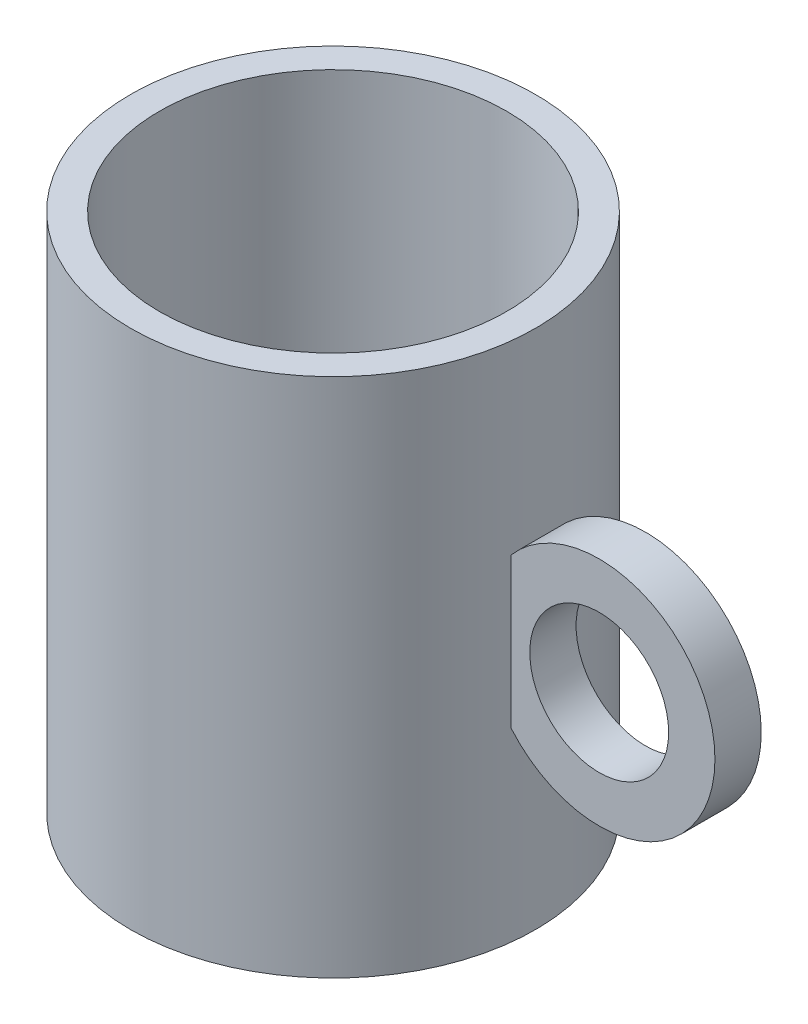
ISO-10303-21;
HEADER;
FILE_DESCRIPTION(('STEP AP214'),'2;1');
FILE_NAME('part.step','',(''),(''),'','','');
FILE_SCHEMA(('AUTOMOTIVE_DESIGN { 1 0 10303 214 1 1 1 1 }'));
ENDSEC;
DATA;
#1=APPLICATION_CONTEXT('core data for automotive mechanical design processes');
#2=APPLICATION_PROTOCOL_DEFINITION('international standard','automotive_design',2000,#1);
#3=PRODUCT_CONTEXT('',#1,'mechanical');
#4=PRODUCT('Part','Part','',(#3));
#5=PRODUCT_RELATED_PRODUCT_CATEGORY('part','',(#4));
#6=PRODUCT_DEFINITION_FORMATION('','',#4);
#7=PRODUCT_DEFINITION_CONTEXT('part definition',#1,'design');
#8=PRODUCT_DEFINITION('design','',#6,#7);
#9=PRODUCT_DEFINITION_SHAPE('','',#8);
#10=(LENGTH_UNIT() NAMED_UNIT(*) SI_UNIT(.MILLI.,.METRE.));
#11=(NAMED_UNIT(*) PLANE_ANGLE_UNIT() SI_UNIT($,.RADIAN.));
#12=(NAMED_UNIT(*) SI_UNIT($,.STERADIAN.) SOLID_ANGLE_UNIT());
#13=UNCERTAINTY_MEASURE_WITH_UNIT(LENGTH_MEASURE(1.E-05),#10,'distance_accuracy_value','');
#14=(GEOMETRIC_REPRESENTATION_CONTEXT(3) GLOBAL_UNCERTAINTY_ASSIGNED_CONTEXT((#13)) GLOBAL_UNIT_ASSIGNED_CONTEXT((#10,
#11,#12)) REPRESENTATION_CONTEXT('',''));
#15=CARTESIAN_POINT('',(0.,0.,0.));
#16=DIRECTION('',(0.,0.,1.));
#17=DIRECTION('',(1.,0.,0.));
#18=AXIS2_PLACEMENT_3D('',#15,#16,#17);
#19=CARTESIAN_POINT('',(0.,90.,0.));
#20=DIRECTION('',(0.,-1.,0.));
#21=DIRECTION('',(0.,0.,-1.));
#22=AXIS2_PLACEMENT_3D('',#19,#20,#21);
#23=CYLINDRICAL_SURFACE('',#22,35.);
#24=CARTESIAN_POINT('',(0.,0.,0.));
#25=DIRECTION('',(0.,1.,0.));
#26=DIRECTION('',(0.,0.,1.));
#27=AXIS2_PLACEMENT_3D('',#24,#25,#26);
#28=CIRCLE('',#27,35.);
#29=CARTESIAN_POINT('',(0.,0.,35.));
#30=VERTEX_POINT('',#29);
#31=EDGE_CURVE('E116',#30,#30,#28,.T.);
#32=ORIENTED_EDGE('',*,*,#31,.T.);
#33=EDGE_LOOP('',(#32));
#34=FACE_BOUND('',#33,.T.);
#35=CARTESIAN_POINT('',(0.,90.,0.));
#36=DIRECTION('',(0.,1.,0.));
#37=DIRECTION('',(0.,0.,1.));
#38=AXIS2_PLACEMENT_3D('',#35,#36,#37);
#39=CIRCLE('',#38,35.);
#40=CARTESIAN_POINT('',(0.,90.,35.));
#41=VERTEX_POINT('',#40);
#42=EDGE_CURVE('E97',#41,#41,#39,.T.);
#43=ORIENTED_EDGE('',*,*,#42,.F.);
#44=EDGE_LOOP('',(#43));
#45=FACE_BOUND('',#44,.T.);
#46=CARTESIAN_POINT('',(34.7706773014274,32.0359061194875,4.));
#47=CARTESIAN_POINT('',(34.8087827871127,31.9911704882159,3.6688477376322));
#48=CARTESIAN_POINT('',(34.8422265218329,31.9522555079999,3.33638190182365));
#49=CARTESIAN_POINT('',(34.8996489955797,31.8858274601218,2.66951514466809));
#50=CARTESIAN_POINT('',(34.9236282105737,31.8583138190869,2.3351143214893));
#51=CARTESIAN_POINT('',(34.9618390449785,31.8146104140387,1.66756879259246));
#52=CARTESIAN_POINT('',(34.976142977129,31.7983366239961,1.3344336993617));
#53=CARTESIAN_POINT('',(34.9952235358369,31.776653046726,0.667532411194072));
#54=CARTESIAN_POINT('',(35.,31.771243444677,0.333766205597036));
#55=CARTESIAN_POINT('',(35.,31.771243444677,-0.333766205597036));
#56=CARTESIAN_POINT('',(34.9952235358369,31.776653046726,-0.667532411194072));
#57=CARTESIAN_POINT('',(34.976142977129,31.7983366239961,-1.3344336993617));
#58=CARTESIAN_POINT('',(34.9618390449785,31.8146104140387,-1.66756879259246));
#59=CARTESIAN_POINT('',(34.9236282105737,31.8583138190869,-2.3351143214893));
#60=CARTESIAN_POINT('',(34.8996489955797,31.8858274601218,-2.66951514466809));
#61=CARTESIAN_POINT('',(34.8422265218329,31.9522555079999,-3.33638190182365));
#62=CARTESIAN_POINT('',(34.8087827871127,31.9911704882159,-3.6688477376322));
#63=CARTESIAN_POINT('',(34.7706773014274,32.0359061194875,-4.));
#64=B_SPLINE_CURVE_WITH_KNOTS('',3,(#46,#47,#48,#49,#50,#51,#52,#53,#54,#55,#56,#57,#58,#59,#60,
#61,#62,#63),.UNSPECIFIED.,.F.,.F.,(4,2,2,2,2,2,2,2,4),(0.,1.00887968115776,2.01770861963792,
3.01891173411826,4.02013191382282,5.02135209352739,6.02255520800773,7.03138414648788,
8.04026382764564),.UNSPECIFIED.);
#65=CARTESIAN_POINT('',(34.7706773014274,32.0359061194875,4.));
#66=VERTEX_POINT('',#65);
#67=CARTESIAN_POINT('',(34.7706773014274,32.0359061194875,-4.));
#68=VERTEX_POINT('',#67);
#69=EDGE_CURVE('E11',#66,#68,#64,.T.);
#70=ORIENTED_EDGE('',*,*,#69,.F.);
#71=DIRECTION('',(0.,-1.,0.));
#72=VECTOR('',#71,1.);
#73=CARTESIAN_POINT('',(34.7706773014274,90.,4.));
#74=LINE('',#73,#72);
#75=CARTESIAN_POINT('',(34.7706773014274,57.9640938805125,4.));
#76=VERTEX_POINT('',#75);
#77=EDGE_CURVE('E66',#66,#76,#74,.F.);
#78=ORIENTED_EDGE('',*,*,#77,.T.);
#79=CARTESIAN_POINT('',(34.7706773014274,57.9640938805125,-4.));
#80=CARTESIAN_POINT('',(34.8087827871127,58.0088295117841,-3.6688477376322));
#81=CARTESIAN_POINT('',(34.8422265218329,58.0477444920001,-3.33638190182365));
#82=CARTESIAN_POINT('',(34.8996489955797,58.1141725398782,-2.66951514466809));
#83=CARTESIAN_POINT('',(34.9236282105737,58.1416861809131,-2.3351143214893));
#84=CARTESIAN_POINT('',(34.9618390449785,58.1853895859613,-1.66756879259246));
#85=CARTESIAN_POINT('',(34.976142977129,58.2016633760039,-1.3344336993617));
#86=CARTESIAN_POINT('',(34.9952235358369,58.223346953274,-0.667532411194071));
#87=CARTESIAN_POINT('',(35.,58.228756555323,-0.333766205597035));
#88=CARTESIAN_POINT('',(35.,58.228756555323,0.333766205597036));
#89=CARTESIAN_POINT('',(34.9952235358369,58.223346953274,0.667532411194072));
#90=CARTESIAN_POINT('',(34.976142977129,58.2016633760039,1.3344336993617));
#91=CARTESIAN_POINT('',(34.9618390449785,58.1853895859613,1.66756879259246));
#92=CARTESIAN_POINT('',(34.9236282105737,58.1416861809131,2.3351143214893));
#93=CARTESIAN_POINT('',(34.8996489955797,58.1141725398782,2.66951514466809));
#94=CARTESIAN_POINT('',(34.8422265218329,58.0477444920001,3.33638190182366));
#95=CARTESIAN_POINT('',(34.8087827871127,58.0088295117841,3.6688477376322));
#96=CARTESIAN_POINT('',(34.7706773014274,57.9640938805125,4.));
#97=B_SPLINE_CURVE_WITH_KNOTS('',3,(#79,#80,#81,#82,#83,#84,#85,#86,#87,#88,#89,#90,#91,#92,#93,
#94,#95,#96),.UNSPECIFIED.,.F.,.F.,(4,2,2,2,2,2,2,2,4),(0.,1.00887968115776,2.01770861963792,
3.01891173411826,4.02013191382282,5.02135209352739,6.02255520800773,7.03138414648788,
8.04026382764564),.UNSPECIFIED.);
#98=CARTESIAN_POINT('',(34.7706773014274,57.9640938805125,-4.));
#99=VERTEX_POINT('',#98);
#100=EDGE_CURVE('E83',#99,#76,#97,.T.);
#101=ORIENTED_EDGE('',*,*,#100,.F.);
#102=DIRECTION('',(0.,-1.,0.));
#103=VECTOR('',#102,1.);
#104=CARTESIAN_POINT('',(34.7706773014274,90.,-4.));
#105=LINE('',#104,#103);
#106=EDGE_CURVE('E89',#68,#99,#105,.F.);
#107=ORIENTED_EDGE('',*,*,#106,.F.);
#108=EDGE_LOOP('',(#70,#78,#101,#107));
#109=FACE_BOUND('',#108,.T.);
#110=ADVANCED_FACE('F51',(#34,#45,#109),#23,.T.);
#111=CARTESIAN_POINT('',(0.,90.,0.));
#112=DIRECTION('',(0.,1.,0.));
#113=DIRECTION('',(0.,0.,1.));
#114=AXIS2_PLACEMENT_3D('',#111,#112,#113);
#115=PLANE('',#114);
#116=CARTESIAN_POINT('',(0.,90.,0.));
#117=DIRECTION('',(0.,1.,0.));
#118=DIRECTION('',(0.,0.,1.));
#119=AXIS2_PLACEMENT_3D('',#116,#117,#118);
#120=CIRCLE('',#119,30.);
#121=CARTESIAN_POINT('',(0.,90.,30.));
#122=VERTEX_POINT('',#121);
#123=EDGE_CURVE('E101',#122,#122,#120,.T.);
#124=ORIENTED_EDGE('',*,*,#123,.F.);
#125=EDGE_LOOP('',(#124));
#126=FACE_BOUND('',#125,.T.);
#127=ORIENTED_EDGE('',*,*,#42,.T.);
#128=EDGE_LOOP('',(#127));
#129=FACE_BOUND('',#128,.T.);
#130=ADVANCED_FACE('F152',(#126,#129),#115,.T.);
#131=CARTESIAN_POINT('',(0.,0.,0.));
#132=DIRECTION('',(0.,1.,0.));
#133=DIRECTION('',(0.,0.,1.));
#134=AXIS2_PLACEMENT_3D('',#131,#132,#133);
#135=PLANE('',#134);
#136=ORIENTED_EDGE('',*,*,#31,.F.);
#137=EDGE_LOOP('',(#136));
#138=FACE_BOUND('',#137,.T.);
#139=ADVANCED_FACE('F150',(#138),#135,.F.);
#140=CARTESIAN_POINT('',(0.,9.99999999999999,0.));
#141=DIRECTION('',(0.,1.,0.));
#142=DIRECTION('',(0.,0.,1.));
#143=AXIS2_PLACEMENT_3D('',#140,#141,#142);
#144=CYLINDRICAL_SURFACE('',#143,30.);
#145=CARTESIAN_POINT('',(30.,45.,0.));
#146=VERTEX_POINT('',#145);
#147=VERTEX_LOOP('',#146);
#148=FACE_BOUND('',#147,.T.);
#149=CARTESIAN_POINT('',(0.,9.99999999999999,0.));
#150=DIRECTION('',(0.,1.,0.));
#151=DIRECTION('',(0.,0.,1.));
#152=AXIS2_PLACEMENT_3D('',#149,#150,#151);
#153=CIRCLE('',#152,30.);
#154=CARTESIAN_POINT('',(0.,9.99999999999999,30.));
#155=VERTEX_POINT('',#154);
#156=EDGE_CURVE('E105',#155,#155,#153,.T.);
#157=ORIENTED_EDGE('',*,*,#156,.F.);
#158=EDGE_LOOP('',(#157));
#159=FACE_BOUND('',#158,.T.);
#160=ORIENTED_EDGE('',*,*,#123,.T.);
#161=EDGE_LOOP('',(#160));
#162=FACE_BOUND('',#161,.T.);
#163=ADVANCED_FACE('F145',(#148,#159,#162),#144,.F.);
#164=CARTESIAN_POINT('',(0.,9.99999999999999,0.));
#165=DIRECTION('',(0.,1.,0.));
#166=DIRECTION('',(0.,0.,1.));
#167=AXIS2_PLACEMENT_3D('',#164,#165,#166);
#168=PLANE('',#167);
#169=ORIENTED_EDGE('',*,*,#156,.T.);
#170=EDGE_LOOP('',(#169));
#171=FACE_BOUND('',#170,.T.);
#172=ADVANCED_FACE('F139',(#171),#168,.T.);
#173=CARTESIAN_POINT('',(50.,45.,4.));
#174=DIRECTION('',(0.,0.,1.));
#175=DIRECTION('',(1.,0.,0.));
#176=AXIS2_PLACEMENT_3D('',#173,#174,#175);
#177=PLANE('',#176);
#178=CARTESIAN_POINT('',(50.,45.,4.));
#179=DIRECTION('',(0.,0.,1.));
#180=DIRECTION('',(1.,0.,0.));
#181=AXIS2_PLACEMENT_3D('',#178,#179,#180);
#182=CIRCLE('',#181,12.);
#183=CARTESIAN_POINT('',(62.,45.,4.));
#184=VERTEX_POINT('',#183);
#185=EDGE_CURVE('E108',#184,#184,#182,.T.);
#186=ORIENTED_EDGE('',*,*,#185,.F.);
#187=EDGE_LOOP('',(#186));
#188=FACE_BOUND('',#187,.T.);
#189=ORIENTED_EDGE('',*,*,#77,.F.);
#190=CARTESIAN_POINT('',(50.,45.,4.));
#191=DIRECTION('',(0.,0.,1.));
#192=DIRECTION('',(1.,0.,0.));
#193=AXIS2_PLACEMENT_3D('',#190,#191,#192);
#194=CIRCLE('',#193,20.);
#195=EDGE_CURVE('E93',#66,#76,#194,.T.);
#196=ORIENTED_EDGE('',*,*,#195,.T.);
#197=EDGE_LOOP('',(#189,#196));
#198=FACE_BOUND('',#197,.T.);
#199=ADVANCED_FACE('F99',(#188,#198),#177,.T.);
#200=CARTESIAN_POINT('',(50.,45.,-4.));
#201=DIRECTION('',(0.,0.,1.));
#202=DIRECTION('',(1.,0.,0.));
#203=AXIS2_PLACEMENT_3D('',#200,#201,#202);
#204=PLANE('',#203);
#205=CARTESIAN_POINT('',(50.,45.,-4.));
#206=DIRECTION('',(0.,0.,1.));
#207=DIRECTION('',(1.,0.,0.));
#208=AXIS2_PLACEMENT_3D('',#205,#206,#207);
#209=CIRCLE('',#208,12.);
#210=CARTESIAN_POINT('',(62.,45.,-4.));
#211=VERTEX_POINT('',#210);
#212=EDGE_CURVE('E111',#211,#211,#209,.T.);
#213=ORIENTED_EDGE('',*,*,#212,.T.);
#214=EDGE_LOOP('',(#213));
#215=FACE_BOUND('',#214,.T.);
#216=CARTESIAN_POINT('',(50.,45.,-4.));
#217=DIRECTION('',(0.,0.,1.));
#218=DIRECTION('',(1.,0.,0.));
#219=AXIS2_PLACEMENT_3D('',#216,#217,#218);
#220=CIRCLE('',#219,20.);
#221=EDGE_CURVE('E95',#68,#99,#220,.T.);
#222=ORIENTED_EDGE('',*,*,#221,.F.);
#223=ORIENTED_EDGE('',*,*,#106,.T.);
#224=EDGE_LOOP('',(#222,#223));
#225=FACE_BOUND('',#224,.T.);
#226=ADVANCED_FACE('F136',(#215,#225),#204,.F.);
#227=CARTESIAN_POINT('',(50.,45.,4.));
#228=DIRECTION('',(0.,0.,-1.));
#229=DIRECTION('',(-1.,0.,0.));
#230=AXIS2_PLACEMENT_3D('',#227,#228,#229);
#231=CYLINDRICAL_SURFACE('',#230,20.);
#232=ORIENTED_EDGE('',*,*,#195,.F.);
#233=ORIENTED_EDGE('',*,*,#69,.T.);
#234=ORIENTED_EDGE('',*,*,#221,.T.);
#235=ORIENTED_EDGE('',*,*,#100,.T.);
#236=EDGE_LOOP('',(#232,#233,#234,#235));
#237=FACE_BOUND('',#236,.T.);
#238=ADVANCED_FACE('F92',(#237),#231,.T.);
#239=CARTESIAN_POINT('',(50.,45.,4.));
#240=DIRECTION('',(0.,0.,-1.));
#241=DIRECTION('',(-1.,0.,0.));
#242=AXIS2_PLACEMENT_3D('',#239,#240,#241);
#243=CYLINDRICAL_SURFACE('',#242,12.);
#244=ORIENTED_EDGE('',*,*,#185,.T.);
#245=EDGE_LOOP('',(#244));
#246=FACE_BOUND('',#245,.T.);
#247=ORIENTED_EDGE('',*,*,#212,.F.);
#248=EDGE_LOOP('',(#247));
#249=FACE_BOUND('',#248,.T.);
#250=ADVANCED_FACE('F135',(#246,#249),#243,.F.);
#251=CLOSED_SHELL('',(#110,#130,#139,#163,#172,#199,#226,#238,#250));
#252=MANIFOLD_SOLID_BREP('B2',#251);
#253=ADVANCED_BREP_SHAPE_REPRESENTATION('',(#18,#252),#14);
#254=SHAPE_DEFINITION_REPRESENTATION(#9,#253);
ENDSEC;
END-ISO-10303-21;
